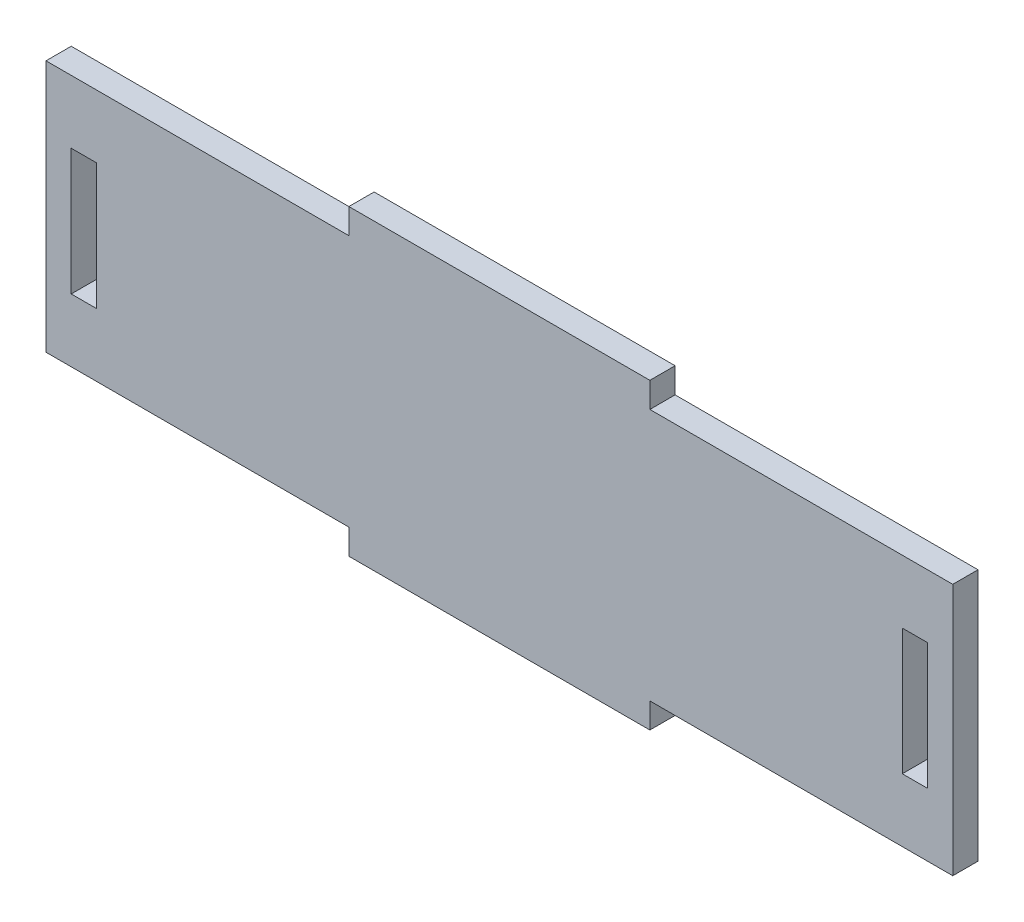
ISO-10303-21;
HEADER;
FILE_DESCRIPTION(('STEP AP214'),'2;1');
FILE_NAME('part.step','',(''),(''),'','','');
FILE_SCHEMA(('AUTOMOTIVE_DESIGN { 1 0 10303 214 1 1 1 1 }'));
ENDSEC;
DATA;
#1=APPLICATION_CONTEXT('core data for automotive mechanical design processes');
#2=APPLICATION_PROTOCOL_DEFINITION('international standard','automotive_design',2000,#1);
#3=PRODUCT_CONTEXT('',#1,'mechanical');
#4=PRODUCT('Part','Part','',(#3));
#5=PRODUCT_RELATED_PRODUCT_CATEGORY('part','',(#4));
#6=PRODUCT_DEFINITION_FORMATION('','',#4);
#7=PRODUCT_DEFINITION_CONTEXT('part definition',#1,'design');
#8=PRODUCT_DEFINITION('design','',#6,#7);
#9=PRODUCT_DEFINITION_SHAPE('','',#8);
#10=(LENGTH_UNIT() NAMED_UNIT(*) SI_UNIT(.MILLI.,.METRE.));
#11=(NAMED_UNIT(*) PLANE_ANGLE_UNIT() SI_UNIT($,.RADIAN.));
#12=(NAMED_UNIT(*) SI_UNIT($,.STERADIAN.) SOLID_ANGLE_UNIT());
#13=UNCERTAINTY_MEASURE_WITH_UNIT(LENGTH_MEASURE(1.E-05),#10,'distance_accuracy_value','');
#14=(GEOMETRIC_REPRESENTATION_CONTEXT(3) GLOBAL_UNCERTAINTY_ASSIGNED_CONTEXT((#13)) GLOBAL_UNIT_ASSIGNED_CONTEXT((#10,
#11,#12)) REPRESENTATION_CONTEXT('',''));
#15=CARTESIAN_POINT('',(0.,0.,0.));
#16=DIRECTION('',(0.,0.,1.));
#17=DIRECTION('',(1.,0.,0.));
#18=AXIS2_PLACEMENT_3D('',#15,#16,#17);
#19=CARTESIAN_POINT('',(0.,0.,2.));
#20=DIRECTION('',(0.,0.,-1.));
#21=DIRECTION('',(-1.,0.,0.));
#22=AXIS2_PLACEMENT_3D('',#19,#20,#21);
#23=PLANE('',#22);
#24=DIRECTION('',(0.,-1.,0.));
#25=VECTOR('',#24,1.);
#26=CARTESIAN_POINT('',(2.,15.,2.));
#27=LINE('',#26,#25);
#28=CARTESIAN_POINT('',(2.,15.,2.));
#29=VERTEX_POINT('',#28);
#30=CARTESIAN_POINT('',(2.,5.,2.));
#31=VERTEX_POINT('',#30);
#32=EDGE_CURVE('E210',#29,#31,#27,.T.);
#33=ORIENTED_EDGE('',*,*,#32,.F.);
#34=DIRECTION('',(-1.,0.,0.));
#35=VECTOR('',#34,1.);
#36=CARTESIAN_POINT('',(2.,15.,2.));
#37=LINE('',#36,#35);
#38=CARTESIAN_POINT('',(3.99999999999999,15.,2.));
#39=VERTEX_POINT('',#38);
#40=EDGE_CURVE('E218',#39,#29,#37,.T.);
#41=ORIENTED_EDGE('',*,*,#40,.F.);
#42=DIRECTION('',(0.,1.,0.));
#43=VECTOR('',#42,1.);
#44=CARTESIAN_POINT('',(3.99999999999999,15.,2.));
#45=LINE('',#44,#43);
#46=CARTESIAN_POINT('',(3.99999999999999,5.,2.));
#47=VERTEX_POINT('',#46);
#48=EDGE_CURVE('E215',#47,#39,#45,.T.);
#49=ORIENTED_EDGE('',*,*,#48,.F.);
#50=DIRECTION('',(1.,0.,0.));
#51=VECTOR('',#50,1.);
#52=CARTESIAN_POINT('',(2.,5.,2.));
#53=LINE('',#52,#51);
#54=EDGE_CURVE('E212',#31,#47,#53,.T.);
#55=ORIENTED_EDGE('',*,*,#54,.F.);
#56=EDGE_LOOP('',(#33,#41,#49,#55));
#57=FACE_BOUND('',#56,.T.);
#58=DIRECTION('',(0.,-1.,0.));
#59=VECTOR('',#58,1.);
#60=CARTESIAN_POINT('',(0.,0.,2.));
#61=LINE('',#60,#59);
#62=CARTESIAN_POINT('',(0.,20.,2.));
#63=VERTEX_POINT('',#62);
#64=CARTESIAN_POINT('',(0.,0.,2.));
#65=VERTEX_POINT('',#64);
#66=EDGE_CURVE('E241',#63,#65,#61,.T.);
#67=ORIENTED_EDGE('',*,*,#66,.T.);
#68=DIRECTION('',(1.,0.,0.));
#69=VECTOR('',#68,1.);
#70=CARTESIAN_POINT('',(0.,0.,2.));
#71=LINE('',#70,#69);
#72=CARTESIAN_POINT('',(24.,0.,2.));
#73=VERTEX_POINT('',#72);
#74=EDGE_CURVE('E244',#65,#73,#71,.T.);
#75=ORIENTED_EDGE('',*,*,#74,.T.);
#76=DIRECTION('',(0.,-1.,0.));
#77=VECTOR('',#76,1.);
#78=CARTESIAN_POINT('',(24.,0.,2.));
#79=LINE('',#78,#77);
#80=CARTESIAN_POINT('',(24.,-2.,2.));
#81=VERTEX_POINT('',#80);
#82=EDGE_CURVE('E247',#73,#81,#79,.T.);
#83=ORIENTED_EDGE('',*,*,#82,.T.);
#84=DIRECTION('',(1.,0.,0.));
#85=VECTOR('',#84,1.);
#86=CARTESIAN_POINT('',(24.,-2.,2.));
#87=LINE('',#86,#85);
#88=CARTESIAN_POINT('',(47.848,-2.,2.));
#89=VERTEX_POINT('',#88);
#90=EDGE_CURVE('E249',#81,#89,#87,.T.);
#91=ORIENTED_EDGE('',*,*,#90,.T.);
#92=DIRECTION('',(0.,1.,0.));
#93=VECTOR('',#92,1.);
#94=CARTESIAN_POINT('',(47.848,-2.,2.));
#95=LINE('',#94,#93);
#96=CARTESIAN_POINT('',(47.848,0.,2.));
#97=VERTEX_POINT('',#96);
#98=EDGE_CURVE('E251',#89,#97,#95,.T.);
#99=ORIENTED_EDGE('',*,*,#98,.T.);
#100=DIRECTION('',(1.,0.,0.));
#101=VECTOR('',#100,1.);
#102=CARTESIAN_POINT('',(47.848,0.,2.));
#103=LINE('',#102,#101);
#104=CARTESIAN_POINT('',(71.848,0.,2.));
#105=VERTEX_POINT('',#104);
#106=EDGE_CURVE('E253',#97,#105,#103,.T.);
#107=ORIENTED_EDGE('',*,*,#106,.T.);
#108=DIRECTION('',(0.,1.,0.));
#109=VECTOR('',#108,1.);
#110=CARTESIAN_POINT('',(71.848,0.,2.));
#111=LINE('',#110,#109);
#112=CARTESIAN_POINT('',(71.848,20.,2.));
#113=VERTEX_POINT('',#112);
#114=EDGE_CURVE('E255',#105,#113,#111,.T.);
#115=ORIENTED_EDGE('',*,*,#114,.T.);
#116=DIRECTION('',(-1.,0.,0.));
#117=VECTOR('',#116,1.);
#118=CARTESIAN_POINT('',(47.848,20.,2.));
#119=LINE('',#118,#117);
#120=CARTESIAN_POINT('',(47.848,20.,2.));
#121=VERTEX_POINT('',#120);
#122=EDGE_CURVE('E257',#113,#121,#119,.T.);
#123=ORIENTED_EDGE('',*,*,#122,.T.);
#124=DIRECTION('',(0.,1.,0.));
#125=VECTOR('',#124,1.);
#126=CARTESIAN_POINT('',(47.848,22.,2.));
#127=LINE('',#126,#125);
#128=CARTESIAN_POINT('',(47.848,22.,2.));
#129=VERTEX_POINT('',#128);
#130=EDGE_CURVE('E259',#121,#129,#127,.T.);
#131=ORIENTED_EDGE('',*,*,#130,.T.);
#132=DIRECTION('',(-1.,0.,0.));
#133=VECTOR('',#132,1.);
#134=CARTESIAN_POINT('',(24.,22.,2.));
#135=LINE('',#134,#133);
#136=CARTESIAN_POINT('',(24.,22.,2.));
#137=VERTEX_POINT('',#136);
#138=EDGE_CURVE('E261',#129,#137,#135,.T.);
#139=ORIENTED_EDGE('',*,*,#138,.T.);
#140=DIRECTION('',(0.,-1.,0.));
#141=VECTOR('',#140,1.);
#142=CARTESIAN_POINT('',(24.,20.,2.));
#143=LINE('',#142,#141);
#144=CARTESIAN_POINT('',(24.,20.,2.));
#145=VERTEX_POINT('',#144);
#146=EDGE_CURVE('E263',#137,#145,#143,.T.);
#147=ORIENTED_EDGE('',*,*,#146,.T.);
#148=DIRECTION('',(-1.,0.,0.));
#149=VECTOR('',#148,1.);
#150=CARTESIAN_POINT('',(0.,20.,2.));
#151=LINE('',#150,#149);
#152=EDGE_CURVE('E265',#145,#63,#151,.T.);
#153=ORIENTED_EDGE('',*,*,#152,.T.);
#154=EDGE_LOOP('',(#67,#75,#83,#91,#99,#107,#115,#123,#131,#139,#147,#153));
#155=FACE_BOUND('',#154,.T.);
#156=DIRECTION('',(0.,-1.,0.));
#157=VECTOR('',#156,1.);
#158=CARTESIAN_POINT('',(67.848,15.,2.));
#159=LINE('',#158,#157);
#160=CARTESIAN_POINT('',(67.848,15.,2.));
#161=VERTEX_POINT('',#160);
#162=CARTESIAN_POINT('',(67.848,5.,2.));
#163=VERTEX_POINT('',#162);
#164=EDGE_CURVE('E174',#161,#163,#159,.T.);
#165=ORIENTED_EDGE('',*,*,#164,.F.);
#166=DIRECTION('',(-1.,0.,0.));
#167=VECTOR('',#166,1.);
#168=CARTESIAN_POINT('',(67.848,15.,2.));
#169=LINE('',#168,#167);
#170=CARTESIAN_POINT('',(69.848,15.,2.));
#171=VERTEX_POINT('',#170);
#172=EDGE_CURVE('E196',#171,#161,#169,.T.);
#173=ORIENTED_EDGE('',*,*,#172,.F.);
#174=DIRECTION('',(0.,1.,0.));
#175=VECTOR('',#174,1.);
#176=CARTESIAN_POINT('',(69.848,15.,2.));
#177=LINE('',#176,#175);
#178=CARTESIAN_POINT('',(69.848,5.,2.));
#179=VERTEX_POINT('',#178);
#180=EDGE_CURVE('E194',#179,#171,#177,.T.);
#181=ORIENTED_EDGE('',*,*,#180,.F.);
#182=DIRECTION('',(1.,0.,0.));
#183=VECTOR('',#182,1.);
#184=CARTESIAN_POINT('',(67.848,5.,2.));
#185=LINE('',#184,#183);
#186=EDGE_CURVE('E182',#163,#179,#185,.T.);
#187=ORIENTED_EDGE('',*,*,#186,.F.);
#188=EDGE_LOOP('',(#165,#173,#181,#187));
#189=FACE_BOUND('',#188,.T.);
#190=ADVANCED_FACE('F37',(#57,#155,#189),#23,.F.);
#191=CARTESIAN_POINT('',(0.,0.,0.));
#192=DIRECTION('',(0.,0.,-1.));
#193=DIRECTION('',(-1.,0.,0.));
#194=AXIS2_PLACEMENT_3D('',#191,#192,#193);
#195=PLANE('',#194);
#196=DIRECTION('',(0.,-1.,0.));
#197=VECTOR('',#196,1.);
#198=CARTESIAN_POINT('',(0.,0.,0.));
#199=LINE('',#198,#197);
#200=CARTESIAN_POINT('',(0.,20.,0.));
#201=VERTEX_POINT('',#200);
#202=CARTESIAN_POINT('',(0.,0.,0.));
#203=VERTEX_POINT('',#202);
#204=EDGE_CURVE('E240',#201,#203,#199,.T.);
#205=ORIENTED_EDGE('',*,*,#204,.F.);
#206=DIRECTION('',(-1.,0.,0.));
#207=VECTOR('',#206,1.);
#208=CARTESIAN_POINT('',(0.,20.,0.));
#209=LINE('',#208,#207);
#210=CARTESIAN_POINT('',(24.,20.,0.));
#211=VERTEX_POINT('',#210);
#212=EDGE_CURVE('E245',#211,#201,#209,.T.);
#213=ORIENTED_EDGE('',*,*,#212,.F.);
#214=DIRECTION('',(0.,-1.,0.));
#215=VECTOR('',#214,1.);
#216=CARTESIAN_POINT('',(24.,20.,0.));
#217=LINE('',#216,#215);
#218=CARTESIAN_POINT('',(24.,22.,0.));
#219=VERTEX_POINT('',#218);
#220=EDGE_CURVE('E288',#219,#211,#217,.T.);
#221=ORIENTED_EDGE('',*,*,#220,.F.);
#222=DIRECTION('',(-1.,0.,0.));
#223=VECTOR('',#222,1.);
#224=CARTESIAN_POINT('',(24.,22.,0.));
#225=LINE('',#224,#223);
#226=CARTESIAN_POINT('',(47.848,22.,0.));
#227=VERTEX_POINT('',#226);
#228=EDGE_CURVE('E286',#227,#219,#225,.T.);
#229=ORIENTED_EDGE('',*,*,#228,.F.);
#230=DIRECTION('',(0.,1.,0.));
#231=VECTOR('',#230,1.);
#232=CARTESIAN_POINT('',(47.848,22.,0.));
#233=LINE('',#232,#231);
#234=CARTESIAN_POINT('',(47.848,20.,0.));
#235=VERTEX_POINT('',#234);
#236=EDGE_CURVE('E284',#235,#227,#233,.T.);
#237=ORIENTED_EDGE('',*,*,#236,.F.);
#238=DIRECTION('',(-1.,0.,0.));
#239=VECTOR('',#238,1.);
#240=CARTESIAN_POINT('',(47.848,20.,0.));
#241=LINE('',#240,#239);
#242=CARTESIAN_POINT('',(71.848,20.,0.));
#243=VERTEX_POINT('',#242);
#244=EDGE_CURVE('E282',#243,#235,#241,.T.);
#245=ORIENTED_EDGE('',*,*,#244,.F.);
#246=DIRECTION('',(0.,1.,0.));
#247=VECTOR('',#246,1.);
#248=CARTESIAN_POINT('',(71.848,0.,0.));
#249=LINE('',#248,#247);
#250=CARTESIAN_POINT('',(71.848,0.,0.));
#251=VERTEX_POINT('',#250);
#252=EDGE_CURVE('E280',#251,#243,#249,.T.);
#253=ORIENTED_EDGE('',*,*,#252,.F.);
#254=DIRECTION('',(1.,0.,0.));
#255=VECTOR('',#254,1.);
#256=CARTESIAN_POINT('',(47.848,0.,0.));
#257=LINE('',#256,#255);
#258=CARTESIAN_POINT('',(47.848,0.,0.));
#259=VERTEX_POINT('',#258);
#260=EDGE_CURVE('E278',#259,#251,#257,.T.);
#261=ORIENTED_EDGE('',*,*,#260,.F.);
#262=DIRECTION('',(0.,1.,0.));
#263=VECTOR('',#262,1.);
#264=CARTESIAN_POINT('',(47.848,-2.,0.));
#265=LINE('',#264,#263);
#266=CARTESIAN_POINT('',(47.848,-2.,0.));
#267=VERTEX_POINT('',#266);
#268=EDGE_CURVE('E276',#267,#259,#265,.T.);
#269=ORIENTED_EDGE('',*,*,#268,.F.);
#270=DIRECTION('',(1.,0.,0.));
#271=VECTOR('',#270,1.);
#272=CARTESIAN_POINT('',(24.,-2.,0.));
#273=LINE('',#272,#271);
#274=CARTESIAN_POINT('',(24.,-2.,0.));
#275=VERTEX_POINT('',#274);
#276=EDGE_CURVE('E274',#275,#267,#273,.T.);
#277=ORIENTED_EDGE('',*,*,#276,.F.);
#278=DIRECTION('',(0.,-1.,0.));
#279=VECTOR('',#278,1.);
#280=CARTESIAN_POINT('',(24.,0.,0.));
#281=LINE('',#280,#279);
#282=CARTESIAN_POINT('',(24.,0.,0.));
#283=VERTEX_POINT('',#282);
#284=EDGE_CURVE('E272',#283,#275,#281,.T.);
#285=ORIENTED_EDGE('',*,*,#284,.F.);
#286=DIRECTION('',(1.,0.,0.));
#287=VECTOR('',#286,1.);
#288=CARTESIAN_POINT('',(0.,0.,0.));
#289=LINE('',#288,#287);
#290=EDGE_CURVE('E270',#203,#283,#289,.T.);
#291=ORIENTED_EDGE('',*,*,#290,.F.);
#292=EDGE_LOOP('',(#205,#213,#221,#229,#237,#245,#253,#261,#269,#277,#285,#291));
#293=FACE_BOUND('',#292,.T.);
#294=DIRECTION('',(-1.,0.,0.));
#295=VECTOR('',#294,1.);
#296=CARTESIAN_POINT('',(2.,15.,0.));
#297=LINE('',#296,#295);
#298=CARTESIAN_POINT('',(3.99999999999999,15.,0.));
#299=VERTEX_POINT('',#298);
#300=CARTESIAN_POINT('',(2.,15.,0.));
#301=VERTEX_POINT('',#300);
#302=EDGE_CURVE('E213',#299,#301,#297,.T.);
#303=ORIENTED_EDGE('',*,*,#302,.T.);
#304=DIRECTION('',(0.,-1.,0.));
#305=VECTOR('',#304,1.);
#306=CARTESIAN_POINT('',(2.,15.,0.));
#307=LINE('',#306,#305);
#308=CARTESIAN_POINT('',(2.,5.,0.));
#309=VERTEX_POINT('',#308);
#310=EDGE_CURVE('E190',#301,#309,#307,.T.);
#311=ORIENTED_EDGE('',*,*,#310,.T.);
#312=DIRECTION('',(1.,0.,0.));
#313=VECTOR('',#312,1.);
#314=CARTESIAN_POINT('',(2.,5.,0.));
#315=LINE('',#314,#313);
#316=CARTESIAN_POINT('',(3.99999999999999,5.,0.));
#317=VERTEX_POINT('',#316);
#318=EDGE_CURVE('E223',#309,#317,#315,.T.);
#319=ORIENTED_EDGE('',*,*,#318,.T.);
#320=DIRECTION('',(0.,1.,0.));
#321=VECTOR('',#320,1.);
#322=CARTESIAN_POINT('',(3.99999999999999,15.,0.));
#323=LINE('',#322,#321);
#324=EDGE_CURVE('E226',#317,#299,#323,.T.);
#325=ORIENTED_EDGE('',*,*,#324,.T.);
#326=EDGE_LOOP('',(#303,#311,#319,#325));
#327=FACE_BOUND('',#326,.T.);
#328=DIRECTION('',(-1.,0.,0.));
#329=VECTOR('',#328,1.);
#330=CARTESIAN_POINT('',(67.848,15.,0.));
#331=LINE('',#330,#329);
#332=CARTESIAN_POINT('',(69.848,15.,0.));
#333=VERTEX_POINT('',#332);
#334=CARTESIAN_POINT('',(67.848,15.,0.));
#335=VERTEX_POINT('',#334);
#336=EDGE_CURVE('E183',#333,#335,#331,.T.);
#337=ORIENTED_EDGE('',*,*,#336,.T.);
#338=DIRECTION('',(0.,-1.,0.));
#339=VECTOR('',#338,1.);
#340=CARTESIAN_POINT('',(67.848,15.,0.));
#341=LINE('',#340,#339);
#342=CARTESIAN_POINT('',(67.848,5.,0.));
#343=VERTEX_POINT('',#342);
#344=EDGE_CURVE('E60',#335,#343,#341,.T.);
#345=ORIENTED_EDGE('',*,*,#344,.T.);
#346=DIRECTION('',(1.,0.,0.));
#347=VECTOR('',#346,1.);
#348=CARTESIAN_POINT('',(67.848,5.,0.));
#349=LINE('',#348,#347);
#350=CARTESIAN_POINT('',(69.848,5.,0.));
#351=VERTEX_POINT('',#350);
#352=EDGE_CURVE('E189',#343,#351,#349,.T.);
#353=ORIENTED_EDGE('',*,*,#352,.T.);
#354=DIRECTION('',(0.,1.,0.));
#355=VECTOR('',#354,1.);
#356=CARTESIAN_POINT('',(69.848,15.,0.));
#357=LINE('',#356,#355);
#358=EDGE_CURVE('E202',#351,#333,#357,.T.);
#359=ORIENTED_EDGE('',*,*,#358,.T.);
#360=EDGE_LOOP('',(#337,#345,#353,#359));
#361=FACE_BOUND('',#360,.T.);
#362=ADVANCED_FACE('F330',(#293,#327,#361),#195,.T.);
#363=CARTESIAN_POINT('',(0.,0.,2.));
#364=DIRECTION('',(1.,0.,0.));
#365=DIRECTION('',(0.,0.,-1.));
#366=AXIS2_PLACEMENT_3D('',#363,#364,#365);
#367=PLANE('',#366);
#368=ORIENTED_EDGE('',*,*,#204,.T.);
#369=DIRECTION('',(0.,0.,-1.));
#370=VECTOR('',#369,1.);
#371=CARTESIAN_POINT('',(0.,0.,2.));
#372=LINE('',#371,#370);
#373=EDGE_CURVE('E11',#65,#203,#372,.T.);
#374=ORIENTED_EDGE('',*,*,#373,.F.);
#375=ORIENTED_EDGE('',*,*,#66,.F.);
#376=DIRECTION('',(0.,0.,-1.));
#377=VECTOR('',#376,1.);
#378=CARTESIAN_POINT('',(0.,20.,2.));
#379=LINE('',#378,#377);
#380=EDGE_CURVE('E267',#63,#201,#379,.T.);
#381=ORIENTED_EDGE('',*,*,#380,.T.);
#382=EDGE_LOOP('',(#368,#374,#375,#381));
#383=FACE_BOUND('',#382,.T.);
#384=ADVANCED_FACE('F39',(#383),#367,.F.);
#385=CARTESIAN_POINT('',(0.,0.,2.));
#386=DIRECTION('',(0.,1.,0.));
#387=DIRECTION('',(0.,0.,1.));
#388=AXIS2_PLACEMENT_3D('',#385,#386,#387);
#389=PLANE('',#388);
#390=ORIENTED_EDGE('',*,*,#290,.T.);
#391=DIRECTION('',(0.,0.,-1.));
#392=VECTOR('',#391,1.);
#393=CARTESIAN_POINT('',(24.,0.,2.));
#394=LINE('',#393,#392);
#395=EDGE_CURVE('E45',#73,#283,#394,.T.);
#396=ORIENTED_EDGE('',*,*,#395,.F.);
#397=ORIENTED_EDGE('',*,*,#74,.F.);
#398=ORIENTED_EDGE('',*,*,#373,.T.);
#399=EDGE_LOOP('',(#390,#396,#397,#398));
#400=FACE_BOUND('',#399,.T.);
#401=ADVANCED_FACE('F347',(#400),#389,.F.);
#402=CARTESIAN_POINT('',(24.,0.,2.));
#403=DIRECTION('',(1.,0.,0.));
#404=DIRECTION('',(0.,0.,-1.));
#405=AXIS2_PLACEMENT_3D('',#402,#403,#404);
#406=PLANE('',#405);
#407=ORIENTED_EDGE('',*,*,#284,.T.);
#408=DIRECTION('',(0.,0.,-1.));
#409=VECTOR('',#408,1.);
#410=CARTESIAN_POINT('',(24.,-2.,2.));
#411=LINE('',#410,#409);
#412=EDGE_CURVE('E317',#81,#275,#411,.T.);
#413=ORIENTED_EDGE('',*,*,#412,.F.);
#414=ORIENTED_EDGE('',*,*,#82,.F.);
#415=ORIENTED_EDGE('',*,*,#395,.T.);
#416=EDGE_LOOP('',(#407,#413,#414,#415));
#417=FACE_BOUND('',#416,.T.);
#418=ADVANCED_FACE('F324',(#417),#406,.F.);
#419=CARTESIAN_POINT('',(24.,-2.,2.));
#420=DIRECTION('',(0.,1.,0.));
#421=DIRECTION('',(0.,0.,1.));
#422=AXIS2_PLACEMENT_3D('',#419,#420,#421);
#423=PLANE('',#422);
#424=ORIENTED_EDGE('',*,*,#276,.T.);
#425=DIRECTION('',(0.,0.,-1.));
#426=VECTOR('',#425,1.);
#427=CARTESIAN_POINT('',(47.848,-2.,2.));
#428=LINE('',#427,#426);
#429=EDGE_CURVE('E314',#89,#267,#428,.T.);
#430=ORIENTED_EDGE('',*,*,#429,.F.);
#431=ORIENTED_EDGE('',*,*,#90,.F.);
#432=ORIENTED_EDGE('',*,*,#412,.T.);
#433=EDGE_LOOP('',(#424,#430,#431,#432));
#434=FACE_BOUND('',#433,.T.);
#435=ADVANCED_FACE('F336',(#434),#423,.F.);
#436=CARTESIAN_POINT('',(47.848,-2.,2.));
#437=DIRECTION('',(-1.,0.,0.));
#438=DIRECTION('',(0.,0.,1.));
#439=AXIS2_PLACEMENT_3D('',#436,#437,#438);
#440=PLANE('',#439);
#441=ORIENTED_EDGE('',*,*,#268,.T.);
#442=DIRECTION('',(0.,0.,-1.));
#443=VECTOR('',#442,1.);
#444=CARTESIAN_POINT('',(47.848,0.,2.));
#445=LINE('',#444,#443);
#446=EDGE_CURVE('E311',#97,#259,#445,.T.);
#447=ORIENTED_EDGE('',*,*,#446,.F.);
#448=ORIENTED_EDGE('',*,*,#98,.F.);
#449=ORIENTED_EDGE('',*,*,#429,.T.);
#450=EDGE_LOOP('',(#441,#447,#448,#449));
#451=FACE_BOUND('',#450,.T.);
#452=ADVANCED_FACE('F340',(#451),#440,.F.);
#453=CARTESIAN_POINT('',(47.848,0.,2.));
#454=DIRECTION('',(0.,1.,0.));
#455=DIRECTION('',(0.,0.,1.));
#456=AXIS2_PLACEMENT_3D('',#453,#454,#455);
#457=PLANE('',#456);
#458=ORIENTED_EDGE('',*,*,#260,.T.);
#459=DIRECTION('',(0.,0.,-1.));
#460=VECTOR('',#459,1.);
#461=CARTESIAN_POINT('',(71.848,0.,2.));
#462=LINE('',#461,#460);
#463=EDGE_CURVE('E308',#105,#251,#462,.T.);
#464=ORIENTED_EDGE('',*,*,#463,.F.);
#465=ORIENTED_EDGE('',*,*,#106,.F.);
#466=ORIENTED_EDGE('',*,*,#446,.T.);
#467=EDGE_LOOP('',(#458,#464,#465,#466));
#468=FACE_BOUND('',#467,.T.);
#469=ADVANCED_FACE('F380',(#468),#457,.F.);
#470=CARTESIAN_POINT('',(71.848,0.,2.));
#471=DIRECTION('',(-1.,0.,0.));
#472=DIRECTION('',(0.,0.,1.));
#473=AXIS2_PLACEMENT_3D('',#470,#471,#472);
#474=PLANE('',#473);
#475=ORIENTED_EDGE('',*,*,#252,.T.);
#476=DIRECTION('',(0.,0.,-1.));
#477=VECTOR('',#476,1.);
#478=CARTESIAN_POINT('',(71.848,20.,2.));
#479=LINE('',#478,#477);
#480=EDGE_CURVE('E305',#113,#243,#479,.T.);
#481=ORIENTED_EDGE('',*,*,#480,.F.);
#482=ORIENTED_EDGE('',*,*,#114,.F.);
#483=ORIENTED_EDGE('',*,*,#463,.T.);
#484=EDGE_LOOP('',(#475,#481,#482,#483));
#485=FACE_BOUND('',#484,.T.);
#486=ADVANCED_FACE('F378',(#485),#474,.F.);
#487=CARTESIAN_POINT('',(47.848,20.,2.));
#488=DIRECTION('',(0.,-1.,0.));
#489=DIRECTION('',(0.,0.,-1.));
#490=AXIS2_PLACEMENT_3D('',#487,#488,#489);
#491=PLANE('',#490);
#492=ORIENTED_EDGE('',*,*,#244,.T.);
#493=DIRECTION('',(0.,0.,-1.));
#494=VECTOR('',#493,1.);
#495=CARTESIAN_POINT('',(47.848,20.,2.));
#496=LINE('',#495,#494);
#497=EDGE_CURVE('E302',#121,#235,#496,.T.);
#498=ORIENTED_EDGE('',*,*,#497,.F.);
#499=ORIENTED_EDGE('',*,*,#122,.F.);
#500=ORIENTED_EDGE('',*,*,#480,.T.);
#501=EDGE_LOOP('',(#492,#498,#499,#500));
#502=FACE_BOUND('',#501,.T.);
#503=ADVANCED_FACE('F374',(#502),#491,.F.);
#504=CARTESIAN_POINT('',(47.848,22.,2.));
#505=DIRECTION('',(-1.,0.,0.));
#506=DIRECTION('',(0.,0.,1.));
#507=AXIS2_PLACEMENT_3D('',#504,#505,#506);
#508=PLANE('',#507);
#509=ORIENTED_EDGE('',*,*,#236,.T.);
#510=DIRECTION('',(0.,0.,-1.));
#511=VECTOR('',#510,1.);
#512=CARTESIAN_POINT('',(47.848,22.,2.));
#513=LINE('',#512,#511);
#514=EDGE_CURVE('E299',#129,#227,#513,.T.);
#515=ORIENTED_EDGE('',*,*,#514,.F.);
#516=ORIENTED_EDGE('',*,*,#130,.F.);
#517=ORIENTED_EDGE('',*,*,#497,.T.);
#518=EDGE_LOOP('',(#509,#515,#516,#517));
#519=FACE_BOUND('',#518,.T.);
#520=ADVANCED_FACE('F369',(#519),#508,.F.);
#521=CARTESIAN_POINT('',(24.,22.,2.));
#522=DIRECTION('',(0.,-1.,0.));
#523=DIRECTION('',(0.,0.,-1.));
#524=AXIS2_PLACEMENT_3D('',#521,#522,#523);
#525=PLANE('',#524);
#526=ORIENTED_EDGE('',*,*,#228,.T.);
#527=DIRECTION('',(0.,0.,-1.));
#528=VECTOR('',#527,1.);
#529=CARTESIAN_POINT('',(24.,22.,2.));
#530=LINE('',#529,#528);
#531=EDGE_CURVE('E296',#137,#219,#530,.T.);
#532=ORIENTED_EDGE('',*,*,#531,.F.);
#533=ORIENTED_EDGE('',*,*,#138,.F.);
#534=ORIENTED_EDGE('',*,*,#514,.T.);
#535=EDGE_LOOP('',(#526,#532,#533,#534));
#536=FACE_BOUND('',#535,.T.);
#537=ADVANCED_FACE('F363',(#536),#525,.F.);
#538=CARTESIAN_POINT('',(24.,20.,2.));
#539=DIRECTION('',(1.,0.,0.));
#540=DIRECTION('',(0.,0.,-1.));
#541=AXIS2_PLACEMENT_3D('',#538,#539,#540);
#542=PLANE('',#541);
#543=ORIENTED_EDGE('',*,*,#220,.T.);
#544=DIRECTION('',(0.,0.,-1.));
#545=VECTOR('',#544,1.);
#546=CARTESIAN_POINT('',(24.,20.,2.));
#547=LINE('',#546,#545);
#548=EDGE_CURVE('E293',#145,#211,#547,.T.);
#549=ORIENTED_EDGE('',*,*,#548,.F.);
#550=ORIENTED_EDGE('',*,*,#146,.F.);
#551=ORIENTED_EDGE('',*,*,#531,.T.);
#552=EDGE_LOOP('',(#543,#549,#550,#551));
#553=FACE_BOUND('',#552,.T.);
#554=ADVANCED_FACE('F359',(#553),#542,.F.);
#555=CARTESIAN_POINT('',(0.,20.,2.));
#556=DIRECTION('',(0.,-1.,0.));
#557=DIRECTION('',(0.,0.,-1.));
#558=AXIS2_PLACEMENT_3D('',#555,#556,#557);
#559=PLANE('',#558);
#560=ORIENTED_EDGE('',*,*,#212,.T.);
#561=ORIENTED_EDGE('',*,*,#380,.F.);
#562=ORIENTED_EDGE('',*,*,#152,.F.);
#563=ORIENTED_EDGE('',*,*,#548,.T.);
#564=EDGE_LOOP('',(#560,#561,#562,#563));
#565=FACE_BOUND('',#564,.T.);
#566=ADVANCED_FACE('F354',(#565),#559,.F.);
#567=CARTESIAN_POINT('',(2.,15.,2.));
#568=DIRECTION('',(1.,0.,0.));
#569=DIRECTION('',(0.,1.,0.));
#570=AXIS2_PLACEMENT_3D('',#567,#568,#569);
#571=PLANE('',#570);
#572=ORIENTED_EDGE('',*,*,#310,.F.);
#573=DIRECTION('',(0.,0.,-1.));
#574=VECTOR('',#573,1.);
#575=CARTESIAN_POINT('',(2.,15.,2.));
#576=LINE('',#575,#574);
#577=EDGE_CURVE('E220',#29,#301,#576,.T.);
#578=ORIENTED_EDGE('',*,*,#577,.F.);
#579=ORIENTED_EDGE('',*,*,#32,.T.);
#580=DIRECTION('',(0.,0.,-1.));
#581=VECTOR('',#580,1.);
#582=CARTESIAN_POINT('',(2.,5.,2.));
#583=LINE('',#582,#581);
#584=EDGE_CURVE('E237',#31,#309,#583,.T.);
#585=ORIENTED_EDGE('',*,*,#584,.T.);
#586=EDGE_LOOP('',(#572,#578,#579,#585));
#587=FACE_BOUND('',#586,.T.);
#588=ADVANCED_FACE('F398',(#587),#571,.T.);
#589=CARTESIAN_POINT('',(2.,5.,2.));
#590=DIRECTION('',(0.,1.,0.));
#591=DIRECTION('',(0.,0.,1.));
#592=AXIS2_PLACEMENT_3D('',#589,#590,#591);
#593=PLANE('',#592);
#594=ORIENTED_EDGE('',*,*,#318,.F.);
#595=ORIENTED_EDGE('',*,*,#584,.F.);
#596=ORIENTED_EDGE('',*,*,#54,.T.);
#597=DIRECTION('',(0.,0.,-1.));
#598=VECTOR('',#597,1.);
#599=CARTESIAN_POINT('',(3.99999999999999,5.,2.));
#600=LINE('',#599,#598);
#601=EDGE_CURVE('E235',#47,#317,#600,.T.);
#602=ORIENTED_EDGE('',*,*,#601,.T.);
#603=EDGE_LOOP('',(#594,#595,#596,#602));
#604=FACE_BOUND('',#603,.T.);
#605=ADVANCED_FACE('F436',(#604),#593,.T.);
#606=CARTESIAN_POINT('',(3.99999999999999,15.,2.));
#607=DIRECTION('',(-1.,0.,0.));
#608=DIRECTION('',(0.,0.,1.));
#609=AXIS2_PLACEMENT_3D('',#606,#607,#608);
#610=PLANE('',#609);
#611=ORIENTED_EDGE('',*,*,#324,.F.);
#612=ORIENTED_EDGE('',*,*,#601,.F.);
#613=ORIENTED_EDGE('',*,*,#48,.T.);
#614=DIRECTION('',(0.,0.,-1.));
#615=VECTOR('',#614,1.);
#616=CARTESIAN_POINT('',(3.99999999999999,15.,2.));
#617=LINE('',#616,#615);
#618=EDGE_CURVE('E233',#39,#299,#617,.T.);
#619=ORIENTED_EDGE('',*,*,#618,.T.);
#620=EDGE_LOOP('',(#611,#612,#613,#619));
#621=FACE_BOUND('',#620,.T.);
#622=ADVANCED_FACE('F443',(#621),#610,.T.);
#623=CARTESIAN_POINT('',(2.,15.,2.));
#624=DIRECTION('',(0.,-1.,0.));
#625=DIRECTION('',(0.,0.,-1.));
#626=AXIS2_PLACEMENT_3D('',#623,#624,#625);
#627=PLANE('',#626);
#628=ORIENTED_EDGE('',*,*,#302,.F.);
#629=ORIENTED_EDGE('',*,*,#618,.F.);
#630=ORIENTED_EDGE('',*,*,#40,.T.);
#631=ORIENTED_EDGE('',*,*,#577,.T.);
#632=EDGE_LOOP('',(#628,#629,#630,#631));
#633=FACE_BOUND('',#632,.T.);
#634=ADVANCED_FACE('F450',(#633),#627,.T.);
#635=CARTESIAN_POINT('',(67.848,15.,2.));
#636=DIRECTION('',(1.,0.,0.));
#637=DIRECTION('',(0.,0.,-1.));
#638=AXIS2_PLACEMENT_3D('',#635,#636,#637);
#639=PLANE('',#638);
#640=ORIENTED_EDGE('',*,*,#344,.F.);
#641=DIRECTION('',(0.,0.,-1.));
#642=VECTOR('',#641,1.);
#643=CARTESIAN_POINT('',(67.848,15.,2.));
#644=LINE('',#643,#642);
#645=EDGE_CURVE('E178',#161,#335,#644,.T.);
#646=ORIENTED_EDGE('',*,*,#645,.F.);
#647=ORIENTED_EDGE('',*,*,#164,.T.);
#648=DIRECTION('',(0.,0.,-1.));
#649=VECTOR('',#648,1.);
#650=CARTESIAN_POINT('',(67.848,5.,2.));
#651=LINE('',#650,#649);
#652=EDGE_CURVE('E177',#163,#343,#651,.T.);
#653=ORIENTED_EDGE('',*,*,#652,.T.);
#654=EDGE_LOOP('',(#640,#646,#647,#653));
#655=FACE_BOUND('',#654,.T.);
#656=ADVANCED_FACE('F176',(#655),#639,.T.);
#657=CARTESIAN_POINT('',(67.848,5.,2.));
#658=DIRECTION('',(0.,1.,0.));
#659=DIRECTION('',(0.,0.,1.));
#660=AXIS2_PLACEMENT_3D('',#657,#658,#659);
#661=PLANE('',#660);
#662=ORIENTED_EDGE('',*,*,#352,.F.);
#663=ORIENTED_EDGE('',*,*,#652,.F.);
#664=ORIENTED_EDGE('',*,*,#186,.T.);
#665=DIRECTION('',(0.,0.,-1.));
#666=VECTOR('',#665,1.);
#667=CARTESIAN_POINT('',(69.848,5.,2.));
#668=LINE('',#667,#666);
#669=EDGE_CURVE('E191',#179,#351,#668,.T.);
#670=ORIENTED_EDGE('',*,*,#669,.T.);
#671=EDGE_LOOP('',(#662,#663,#664,#670));
#672=FACE_BOUND('',#671,.T.);
#673=ADVANCED_FACE('F186',(#672),#661,.T.);
#674=CARTESIAN_POINT('',(69.848,15.,2.));
#675=DIRECTION('',(-1.,0.,0.));
#676=DIRECTION('',(0.,0.,1.));
#677=AXIS2_PLACEMENT_3D('',#674,#675,#676);
#678=PLANE('',#677);
#679=ORIENTED_EDGE('',*,*,#358,.F.);
#680=ORIENTED_EDGE('',*,*,#669,.F.);
#681=ORIENTED_EDGE('',*,*,#180,.T.);
#682=DIRECTION('',(0.,0.,-1.));
#683=VECTOR('',#682,1.);
#684=CARTESIAN_POINT('',(69.848,15.,2.));
#685=LINE('',#684,#683);
#686=EDGE_CURVE('E52',#171,#333,#685,.T.);
#687=ORIENTED_EDGE('',*,*,#686,.T.);
#688=EDGE_LOOP('',(#679,#680,#681,#687));
#689=FACE_BOUND('',#688,.T.);
#690=ADVANCED_FACE('F471',(#689),#678,.T.);
#691=CARTESIAN_POINT('',(67.848,15.,2.));
#692=DIRECTION('',(0.,-1.,0.));
#693=DIRECTION('',(0.,0.,-1.));
#694=AXIS2_PLACEMENT_3D('',#691,#692,#693);
#695=PLANE('',#694);
#696=ORIENTED_EDGE('',*,*,#336,.F.);
#697=ORIENTED_EDGE('',*,*,#686,.F.);
#698=ORIENTED_EDGE('',*,*,#172,.T.);
#699=ORIENTED_EDGE('',*,*,#645,.T.);
#700=EDGE_LOOP('',(#696,#697,#698,#699));
#701=FACE_BOUND('',#700,.T.);
#702=ADVANCED_FACE('F478',(#701),#695,.T.);
#703=CLOSED_SHELL('',(#190,#362,#384,#401,#418,#435,#452,#469,#486,#503,#520,#537,#554,#566,
#588,#605,#622,#634,#656,#673,#690,#702));
#704=MANIFOLD_SOLID_BREP('B2',#703);
#705=ADVANCED_BREP_SHAPE_REPRESENTATION('',(#18,#704),#14);
#706=SHAPE_DEFINITION_REPRESENTATION(#9,#705);
ENDSEC;
END-ISO-10303-21;
